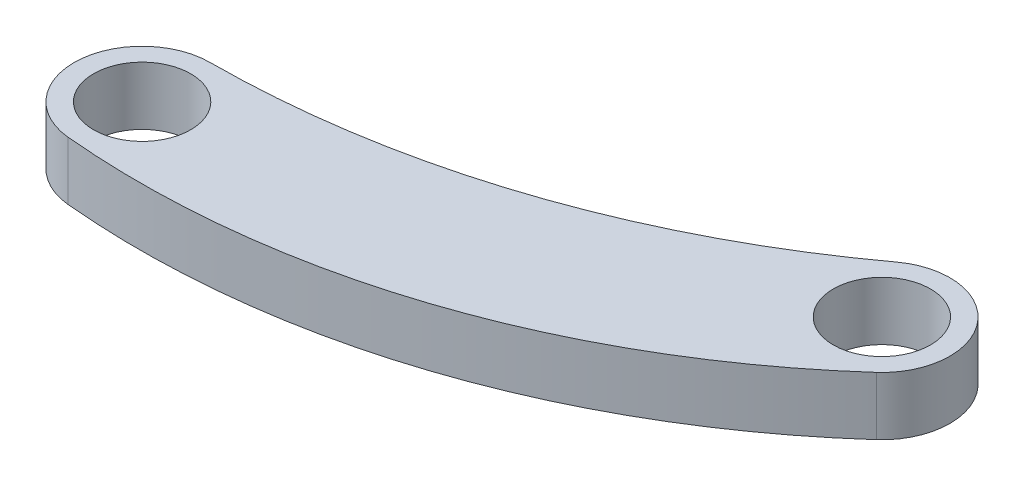
ISO-10303-21;
HEADER;
FILE_DESCRIPTION(('STEP AP214'),'2;1');
FILE_NAME('part.step','',(''),(''),'','','');
FILE_SCHEMA(('AUTOMOTIVE_DESIGN { 1 0 10303 214 1 1 1 1 }'));
ENDSEC;
DATA;
#1=APPLICATION_CONTEXT('core data for automotive mechanical design processes');
#2=APPLICATION_PROTOCOL_DEFINITION('international standard','automotive_design',2000,#1);
#3=PRODUCT_CONTEXT('',#1,'mechanical');
#4=PRODUCT('Part','Part','',(#3));
#5=PRODUCT_RELATED_PRODUCT_CATEGORY('part','',(#4));
#6=PRODUCT_DEFINITION_FORMATION('','',#4);
#7=PRODUCT_DEFINITION_CONTEXT('part definition',#1,'design');
#8=PRODUCT_DEFINITION('design','',#6,#7);
#9=PRODUCT_DEFINITION_SHAPE('','',#8);
#10=(LENGTH_UNIT() NAMED_UNIT(*) SI_UNIT(.MILLI.,.METRE.));
#11=(NAMED_UNIT(*) PLANE_ANGLE_UNIT() SI_UNIT($,.RADIAN.));
#12=(NAMED_UNIT(*) SI_UNIT($,.STERADIAN.) SOLID_ANGLE_UNIT());
#13=UNCERTAINTY_MEASURE_WITH_UNIT(LENGTH_MEASURE(1.E-05),#10,'distance_accuracy_value','');
#14=(GEOMETRIC_REPRESENTATION_CONTEXT(3) GLOBAL_UNCERTAINTY_ASSIGNED_CONTEXT((#13)) GLOBAL_UNIT_ASSIGNED_CONTEXT((#10,
#11,#12)) REPRESENTATION_CONTEXT('',''));
#15=CARTESIAN_POINT('',(0.,0.,0.));
#16=DIRECTION('',(0.,0.,1.));
#17=DIRECTION('',(1.,0.,0.));
#18=AXIS2_PLACEMENT_3D('',#15,#16,#17);
#19=CARTESIAN_POINT('',(6.67355342036524,3.,35.1041383918014));
#20=DIRECTION('',(0.,-1.,0.));
#21=DIRECTION('',(0.,0.,-1.));
#22=AXIS2_PLACEMENT_3D('',#19,#20,#21);
#23=CYLINDRICAL_SURFACE('',#22,45.);
#24=CARTESIAN_POINT('',(6.67355342036524,0.,35.1041383918014));
#25=DIRECTION('',(0.,-1.,0.));
#26=DIRECTION('',(0.,0.,1.));
#27=AXIS2_PLACEMENT_3D('',#24,#25,#26);
#28=CIRCLE('',#27,45.);
#29=CARTESIAN_POINT('',(33.3555572744116,0.,71.340455400193));
#30=VERTEX_POINT('',#29);
#31=CARTESIAN_POINT('',(6.79623272561747,0.,80.1039711669135));
#32=VERTEX_POINT('',#31);
#33=EDGE_CURVE('E99',#30,#32,#28,.T.);
#34=ORIENTED_EDGE('',*,*,#33,.T.);
#35=DIRECTION('',(0.,-1.,0.));
#36=VECTOR('',#35,1.);
#37=CARTESIAN_POINT('',(6.79623272561747,3.,80.1039711669135));
#38=LINE('',#37,#36);
#39=CARTESIAN_POINT('',(6.79623272561747,3.,80.1039711669135));
#40=VERTEX_POINT('',#39);
#41=EDGE_CURVE('E11',#40,#32,#38,.T.);
#42=ORIENTED_EDGE('',*,*,#41,.F.);
#43=CARTESIAN_POINT('',(6.67355342036524,3.,35.1041383918014));
#44=DIRECTION('',(0.,-1.,0.));
#45=DIRECTION('',(0.,0.,1.));
#46=AXIS2_PLACEMENT_3D('',#43,#44,#45);
#47=CIRCLE('',#46,45.);
#48=CARTESIAN_POINT('',(33.3555572744116,3.,71.340455400193));
#49=VERTEX_POINT('',#48);
#50=EDGE_CURVE('E87',#49,#40,#47,.T.);
#51=ORIENTED_EDGE('',*,*,#50,.F.);
#52=DIRECTION('',(0.,-1.,0.));
#53=VECTOR('',#52,1.);
#54=CARTESIAN_POINT('',(33.3555572744116,3.,71.340455400193));
#55=LINE('',#54,#53);
#56=EDGE_CURVE('E95',#49,#30,#55,.T.);
#57=ORIENTED_EDGE('',*,*,#56,.T.);
#58=EDGE_LOOP('',(#34,#42,#51,#57));
#59=FACE_BOUND('',#58,.T.);
#60=ADVANCED_FACE('F36',(#59),#23,.F.);
#61=CARTESIAN_POINT('',(6.8057744493593,3.,83.6039581605334));
#62=DIRECTION('',(0.,-1.,0.));
#63=DIRECTION('',(0.,0.,-1.));
#64=AXIS2_PLACEMENT_3D('',#61,#62,#63);
#65=CYLINDRICAL_SURFACE('',#64,3.5);
#66=CARTESIAN_POINT('',(6.8057744493593,0.,83.6039581605334));
#67=DIRECTION('',(0.,1.,0.));
#68=DIRECTION('',(0.,0.,1.));
#69=AXIS2_PLACEMENT_3D('',#66,#67,#68);
#70=CIRCLE('',#69,3.5);
#71=CARTESIAN_POINT('',(6.47961885054197,0.,87.0887282426708));
#72=VERTEX_POINT('',#71);
#73=EDGE_CURVE('E91',#32,#72,#70,.T.);
#74=ORIENTED_EDGE('',*,*,#73,.T.);
#75=DIRECTION('',(0.,-1.,0.));
#76=VECTOR('',#75,1.);
#77=CARTESIAN_POINT('',(6.47961885054197,3.,87.0887282426708));
#78=LINE('',#77,#76);
#79=CARTESIAN_POINT('',(6.47961885054197,3.,87.0887282426708));
#80=VERTEX_POINT('',#79);
#81=EDGE_CURVE('E44',#80,#72,#78,.T.);
#82=ORIENTED_EDGE('',*,*,#81,.F.);
#83=CARTESIAN_POINT('',(6.8057744493593,3.,83.6039581605334));
#84=DIRECTION('',(0.,1.,0.));
#85=DIRECTION('',(0.,0.,1.));
#86=AXIS2_PLACEMENT_3D('',#83,#84,#85);
#87=CIRCLE('',#86,3.5);
#88=EDGE_CURVE('E82',#40,#80,#87,.T.);
#89=ORIENTED_EDGE('',*,*,#88,.F.);
#90=ORIENTED_EDGE('',*,*,#41,.T.);
#91=EDGE_LOOP('',(#74,#82,#89,#90));
#92=FACE_BOUND('',#91,.T.);
#93=ADVANCED_FACE('F90',(#92),#65,.T.);
#94=CARTESIAN_POINT('',(10.3128053625339,3.,46.1335101667614));
#95=DIRECTION('',(0.,-1.,0.));
#96=DIRECTION('',(0.,0.,-1.));
#97=AXIS2_PLACEMENT_3D('',#94,#95,#96);
#98=CYLINDRICAL_SURFACE('',#97,41.1342096858687);
#99=CARTESIAN_POINT('',(10.3128053625339,0.,46.1335101667614));
#100=DIRECTION('',(0.,1.,0.));
#101=DIRECTION('',(0.,0.,1.));
#102=AXIS2_PLACEMENT_3D('',#99,#100,#101);
#103=CIRCLE('',#102,41.1342096858687);
#104=CARTESIAN_POINT('',(37.7668123433609,0.,76.7652046542969));
#105=VERTEX_POINT('',#104);
#106=EDGE_CURVE('E69',#72,#105,#103,.T.);
#107=ORIENTED_EDGE('',*,*,#106,.T.);
#108=DIRECTION('',(0.,-1.,0.));
#109=VECTOR('',#108,1.);
#110=CARTESIAN_POINT('',(37.7668123433609,3.,76.7652046542969));
#111=LINE('',#110,#109);
#112=CARTESIAN_POINT('',(37.7668123433609,3.,76.7652046542969));
#113=VERTEX_POINT('',#112);
#114=EDGE_CURVE('E92',#113,#105,#111,.T.);
#115=ORIENTED_EDGE('',*,*,#114,.F.);
#116=CARTESIAN_POINT('',(10.3128053625339,3.,46.1335101667614));
#117=DIRECTION('',(0.,1.,0.));
#118=DIRECTION('',(0.,0.,1.));
#119=AXIS2_PLACEMENT_3D('',#116,#117,#118);
#120=CIRCLE('',#119,41.1342096858687);
#121=EDGE_CURVE('E85',#80,#113,#120,.T.);
#122=ORIENTED_EDGE('',*,*,#121,.F.);
#123=ORIENTED_EDGE('',*,*,#81,.T.);
#124=EDGE_LOOP('',(#107,#115,#122,#123));
#125=FACE_BOUND('',#124,.T.);
#126=ADVANCED_FACE('F93',(#125),#98,.T.);
#127=CARTESIAN_POINT('',(35.4308242408375,3.,74.1588356119568));
#128=DIRECTION('',(0.,-1.,0.));
#129=DIRECTION('',(0.,0.,-1.));
#130=AXIS2_PLACEMENT_3D('',#127,#128,#129);
#131=CYLINDRICAL_SURFACE('',#130,3.50000000000001);
#132=CARTESIAN_POINT('',(35.4308242408375,0.,74.1588356119568));
#133=DIRECTION('',(0.,1.,0.));
#134=DIRECTION('',(0.,0.,1.));
#135=AXIS2_PLACEMENT_3D('',#132,#133,#134);
#136=CIRCLE('',#135,3.50000000000001);
#137=EDGE_CURVE('E75',#105,#30,#136,.T.);
#138=ORIENTED_EDGE('',*,*,#137,.T.);
#139=ORIENTED_EDGE('',*,*,#56,.F.);
#140=CARTESIAN_POINT('',(35.4308242408375,3.,74.1588356119568));
#141=DIRECTION('',(0.,1.,0.));
#142=DIRECTION('',(0.,0.,1.));
#143=AXIS2_PLACEMENT_3D('',#140,#141,#142);
#144=CIRCLE('',#143,3.50000000000001);
#145=EDGE_CURVE('E52',#113,#49,#144,.T.);
#146=ORIENTED_EDGE('',*,*,#145,.F.);
#147=ORIENTED_EDGE('',*,*,#114,.T.);
#148=EDGE_LOOP('',(#138,#139,#146,#147));
#149=FACE_BOUND('',#148,.T.);
#150=ADVANCED_FACE('F107',(#149),#131,.T.);
#151=CARTESIAN_POINT('',(21.0521888306013,3.,54.6314870018791));
#152=DIRECTION('',(0.,1.,0.));
#153=DIRECTION('',(0.,0.,1.));
#154=AXIS2_PLACEMENT_3D('',#151,#152,#153);
#155=PLANE('',#154);
#156=CARTESIAN_POINT('',(6.8057744493593,3.,83.6039581605334));
#157=DIRECTION('',(0.,1.,0.));
#158=DIRECTION('',(0.,0.,1.));
#159=AXIS2_PLACEMENT_3D('',#156,#157,#158);
#160=CIRCLE('',#159,2.5);
#161=CARTESIAN_POINT('',(6.8057744493593,3.,86.1039581605334));
#162=VERTEX_POINT('',#161);
#163=EDGE_CURVE('E102',#162,#162,#160,.T.);
#164=ORIENTED_EDGE('',*,*,#163,.F.);
#165=EDGE_LOOP('',(#164));
#166=FACE_BOUND('',#165,.T.);
#167=CARTESIAN_POINT('',(35.4308242408375,3.,74.1588356119568));
#168=DIRECTION('',(0.,1.,0.));
#169=DIRECTION('',(0.,0.,1.));
#170=AXIS2_PLACEMENT_3D('',#167,#168,#169);
#171=CIRCLE('',#170,2.5);
#172=CARTESIAN_POINT('',(35.4308242408375,3.,76.6588356119568));
#173=VERTEX_POINT('',#172);
#174=EDGE_CURVE('E116',#173,#173,#171,.T.);
#175=ORIENTED_EDGE('',*,*,#174,.F.);
#176=EDGE_LOOP('',(#175));
#177=FACE_BOUND('',#176,.T.);
#178=ORIENTED_EDGE('',*,*,#50,.T.);
#179=ORIENTED_EDGE('',*,*,#88,.T.);
#180=ORIENTED_EDGE('',*,*,#121,.T.);
#181=ORIENTED_EDGE('',*,*,#145,.T.);
#182=EDGE_LOOP('',(#178,#179,#180,#181));
#183=FACE_BOUND('',#182,.T.);
#184=ADVANCED_FACE('F83',(#166,#177,#183),#155,.T.);
#185=CARTESIAN_POINT('',(21.0521888306013,0.,54.6314870018791));
#186=DIRECTION('',(0.,1.,0.));
#187=DIRECTION('',(0.,0.,1.));
#188=AXIS2_PLACEMENT_3D('',#185,#186,#187);
#189=PLANE('',#188);
#190=CARTESIAN_POINT('',(6.8057744493593,0.,83.6039581605334));
#191=DIRECTION('',(0.,1.,0.));
#192=DIRECTION('',(0.,0.,1.));
#193=AXIS2_PLACEMENT_3D('',#190,#191,#192);
#194=CIRCLE('',#193,2.5);
#195=CARTESIAN_POINT('',(6.8057744493593,0.,86.1039581605334));
#196=VERTEX_POINT('',#195);
#197=EDGE_CURVE('E119',#196,#196,#194,.T.);
#198=ORIENTED_EDGE('',*,*,#197,.T.);
#199=EDGE_LOOP('',(#198));
#200=FACE_BOUND('',#199,.T.);
#201=CARTESIAN_POINT('',(35.4308242408375,0.,74.1588356119568));
#202=DIRECTION('',(0.,1.,0.));
#203=DIRECTION('',(0.,0.,1.));
#204=AXIS2_PLACEMENT_3D('',#201,#202,#203);
#205=CIRCLE('',#204,2.5);
#206=CARTESIAN_POINT('',(35.4308242408375,0.,76.6588356119568));
#207=VERTEX_POINT('',#206);
#208=EDGE_CURVE('E113',#207,#207,#205,.T.);
#209=ORIENTED_EDGE('',*,*,#208,.T.);
#210=EDGE_LOOP('',(#209));
#211=FACE_BOUND('',#210,.T.);
#212=ORIENTED_EDGE('',*,*,#33,.F.);
#213=ORIENTED_EDGE('',*,*,#137,.F.);
#214=ORIENTED_EDGE('',*,*,#106,.F.);
#215=ORIENTED_EDGE('',*,*,#73,.F.);
#216=EDGE_LOOP('',(#212,#213,#214,#215));
#217=FACE_BOUND('',#216,.T.);
#218=ADVANCED_FACE('F110',(#200,#211,#217),#189,.F.);
#219=CARTESIAN_POINT('',(35.4308242408375,3.,74.1588356119568));
#220=DIRECTION('',(0.,-1.,0.));
#221=DIRECTION('',(0.,0.,-1.));
#222=AXIS2_PLACEMENT_3D('',#219,#220,#221);
#223=CYLINDRICAL_SURFACE('',#222,2.5);
#224=ORIENTED_EDGE('',*,*,#174,.T.);
#225=EDGE_LOOP('',(#224));
#226=FACE_BOUND('',#225,.T.);
#227=ORIENTED_EDGE('',*,*,#208,.F.);
#228=EDGE_LOOP('',(#227));
#229=FACE_BOUND('',#228,.T.);
#230=ADVANCED_FACE('F133',(#226,#229),#223,.F.);
#231=CARTESIAN_POINT('',(6.8057744493593,3.,83.6039581605334));
#232=DIRECTION('',(0.,-1.,0.));
#233=DIRECTION('',(0.,0.,-1.));
#234=AXIS2_PLACEMENT_3D('',#231,#232,#233);
#235=CYLINDRICAL_SURFACE('',#234,2.5);
#236=ORIENTED_EDGE('',*,*,#163,.T.);
#237=EDGE_LOOP('',(#236));
#238=FACE_BOUND('',#237,.T.);
#239=ORIENTED_EDGE('',*,*,#197,.F.);
#240=EDGE_LOOP('',(#239));
#241=FACE_BOUND('',#240,.T.);
#242=ADVANCED_FACE('F125',(#238,#241),#235,.F.);
#243=CLOSED_SHELL('',(#60,#93,#126,#150,#184,#218,#230,#242));
#244=MANIFOLD_SOLID_BREP('B2',#243);
#245=ADVANCED_BREP_SHAPE_REPRESENTATION('',(#18,#244),#14);
#246=SHAPE_DEFINITION_REPRESENTATION(#9,#245);
ENDSEC;
END-ISO-10303-21;
